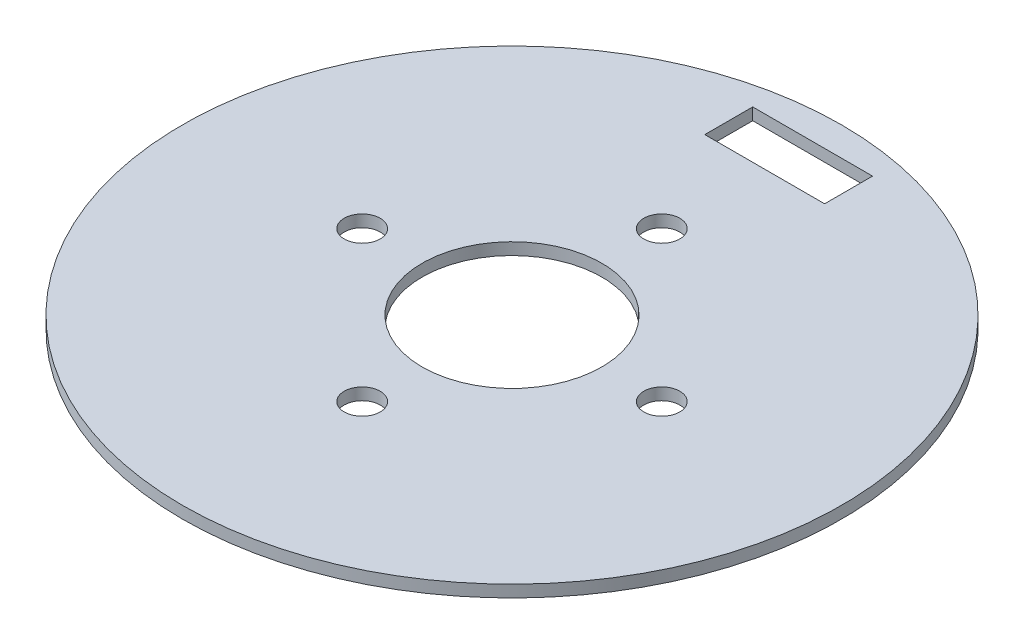
ISO-10303-21;
HEADER;
FILE_DESCRIPTION(('STEP AP214'),'2;1');
FILE_NAME('part.step','',(''),(''),'','','');
FILE_SCHEMA(('AUTOMOTIVE_DESIGN { 1 0 10303 214 1 1 1 1 }'));
ENDSEC;
DATA;
#1=APPLICATION_CONTEXT('core data for automotive mechanical design processes');
#2=APPLICATION_PROTOCOL_DEFINITION('international standard','automotive_design',2000,#1);
#3=PRODUCT_CONTEXT('',#1,'mechanical');
#4=PRODUCT('Part','Part','',(#3));
#5=PRODUCT_RELATED_PRODUCT_CATEGORY('part','',(#4));
#6=PRODUCT_DEFINITION_FORMATION('','',#4);
#7=PRODUCT_DEFINITION_CONTEXT('part definition',#1,'design');
#8=PRODUCT_DEFINITION('design','',#6,#7);
#9=PRODUCT_DEFINITION_SHAPE('','',#8);
#10=(LENGTH_UNIT() NAMED_UNIT(*) SI_UNIT(.MILLI.,.METRE.));
#11=(NAMED_UNIT(*) PLANE_ANGLE_UNIT() SI_UNIT($,.RADIAN.));
#12=(NAMED_UNIT(*) SI_UNIT($,.STERADIAN.) SOLID_ANGLE_UNIT());
#13=UNCERTAINTY_MEASURE_WITH_UNIT(LENGTH_MEASURE(1.E-05),#10,'distance_accuracy_value','');
#14=(GEOMETRIC_REPRESENTATION_CONTEXT(3) GLOBAL_UNCERTAINTY_ASSIGNED_CONTEXT((#13)) GLOBAL_UNIT_ASSIGNED_CONTEXT((#10,
#11,#12)) REPRESENTATION_CONTEXT('',''));
#15=CARTESIAN_POINT('',(0.,0.,0.));
#16=DIRECTION('',(0.,0.,1.));
#17=DIRECTION('',(1.,0.,0.));
#18=AXIS2_PLACEMENT_3D('',#15,#16,#17);
#19=CARTESIAN_POINT('',(0.,1.,0.));
#20=DIRECTION('',(0.,1.,0.));
#21=DIRECTION('',(0.,0.,1.));
#22=AXIS2_PLACEMENT_3D('',#19,#20,#21);
#23=PLANE('',#22);
#24=CARTESIAN_POINT('',(7.07481118762232E-13,1.,12.5));
#25=DIRECTION('',(0.,1.,0.));
#26=DIRECTION('',(0.,0.,1.));
#27=AXIS2_PLACEMENT_3D('',#24,#25,#26);
#28=CIRCLE('',#27,1.50000000000076);
#29=CARTESIAN_POINT('',(7.07481118762232E-13,1.,14.0000000000008));
#30=VERTEX_POINT('',#29);
#31=EDGE_CURVE('E115',#30,#30,#28,.T.);
#32=ORIENTED_EDGE('',*,*,#31,.F.);
#33=EDGE_LOOP('',(#32));
#34=FACE_BOUND('',#33,.T.);
#35=CARTESIAN_POINT('',(0.,1.,0.));
#36=DIRECTION('',(0.,1.,0.));
#37=DIRECTION('',(0.,0.,1.));
#38=AXIS2_PLACEMENT_3D('',#35,#36,#37);
#39=CIRCLE('',#38,7.5);
#40=CARTESIAN_POINT('',(0.,1.,7.5));
#41=VERTEX_POINT('',#40);
#42=EDGE_CURVE('E127',#41,#41,#39,.T.);
#43=ORIENTED_EDGE('',*,*,#42,.F.);
#44=EDGE_LOOP('',(#43));
#45=FACE_BOUND('',#44,.T.);
#46=CARTESIAN_POINT('',(0.,1.,0.));
#47=DIRECTION('',(0.,1.,0.));
#48=DIRECTION('',(0.,0.,1.));
#49=AXIS2_PLACEMENT_3D('',#46,#47,#48);
#50=CIRCLE('',#49,27.5);
#51=CARTESIAN_POINT('',(0.,1.,27.5));
#52=VERTEX_POINT('',#51);
#53=EDGE_CURVE('E11',#52,#52,#50,.T.);
#54=ORIENTED_EDGE('',*,*,#53,.T.);
#55=EDGE_LOOP('',(#54));
#56=FACE_BOUND('',#55,.T.);
#57=CARTESIAN_POINT('',(0.,1.,-12.5));
#58=DIRECTION('',(0.,1.,0.));
#59=DIRECTION('',(0.,0.,1.));
#60=AXIS2_PLACEMENT_3D('',#57,#58,#59);
#61=CIRCLE('',#60,1.5);
#62=CARTESIAN_POINT('',(0.,1.,-11.));
#63=VERTEX_POINT('',#62);
#64=EDGE_CURVE('E133',#63,#63,#61,.T.);
#65=ORIENTED_EDGE('',*,*,#64,.F.);
#66=EDGE_LOOP('',(#65));
#67=FACE_BOUND('',#66,.T.);
#68=CARTESIAN_POINT('',(12.5,1.,0.));
#69=DIRECTION('',(0.,1.,0.));
#70=DIRECTION('',(0.,0.,1.));
#71=AXIS2_PLACEMENT_3D('',#68,#69,#70);
#72=CIRCLE('',#71,1.5);
#73=CARTESIAN_POINT('',(12.5,1.,1.50000000000004));
#74=VERTEX_POINT('',#73);
#75=EDGE_CURVE('E121',#74,#74,#72,.T.);
#76=ORIENTED_EDGE('',*,*,#75,.F.);
#77=EDGE_LOOP('',(#76));
#78=FACE_BOUND('',#77,.T.);
#79=CARTESIAN_POINT('',(-12.5,1.,-1.30930550206618E-13));
#80=DIRECTION('',(0.,1.,0.));
#81=DIRECTION('',(0.,0.,1.));
#82=AXIS2_PLACEMENT_3D('',#79,#80,#81);
#83=CIRCLE('',#82,1.5);
#84=CARTESIAN_POINT('',(-12.5,1.,1.49999999999987));
#85=VERTEX_POINT('',#84);
#86=EDGE_CURVE('E109',#85,#85,#83,.T.);
#87=ORIENTED_EDGE('',*,*,#86,.F.);
#88=EDGE_LOOP('',(#87));
#89=FACE_BOUND('',#88,.T.);
#90=DIRECTION('',(-1.,0.,0.));
#91=VECTOR('',#90,1.);
#92=CARTESIAN_POINT('',(-5.,1.,-25.0863625228448));
#93=LINE('',#92,#91);
#94=CARTESIAN_POINT('',(5.,1.,-25.0863625228448));
#95=VERTEX_POINT('',#94);
#96=CARTESIAN_POINT('',(-5.,1.,-25.0863625228448));
#97=VERTEX_POINT('',#96);
#98=EDGE_CURVE('E81',#95,#97,#93,.T.);
#99=ORIENTED_EDGE('',*,*,#98,.F.);
#100=DIRECTION('',(0.,0.,-1.));
#101=VECTOR('',#100,1.);
#102=CARTESIAN_POINT('',(5.,1.,-25.0863625228448));
#103=LINE('',#102,#101);
#104=CARTESIAN_POINT('',(5.,1.,-21.0863625228448));
#105=VERTEX_POINT('',#104);
#106=EDGE_CURVE('E73',#105,#95,#103,.T.);
#107=ORIENTED_EDGE('',*,*,#106,.F.);
#108=DIRECTION('',(1.,0.,0.));
#109=VECTOR('',#108,1.);
#110=CARTESIAN_POINT('',(-5.,1.,-21.0863625228448));
#111=LINE('',#110,#109);
#112=CARTESIAN_POINT('',(-5.,1.,-21.0863625228448));
#113=VERTEX_POINT('',#112);
#114=EDGE_CURVE('E95',#113,#105,#111,.T.);
#115=ORIENTED_EDGE('',*,*,#114,.F.);
#116=DIRECTION('',(0.,0.,1.));
#117=VECTOR('',#116,1.);
#118=CARTESIAN_POINT('',(-5.,1.,-25.0863625228448));
#119=LINE('',#118,#117);
#120=EDGE_CURVE('E93',#97,#113,#119,.T.);
#121=ORIENTED_EDGE('',*,*,#120,.F.);
#122=EDGE_LOOP('',(#99,#107,#115,#121));
#123=FACE_BOUND('',#122,.T.);
#124=ADVANCED_FACE('F32',(#34,#45,#56,#67,#78,#89,#123),#23,.T.);
#125=CARTESIAN_POINT('',(0.,0.,0.));
#126=DIRECTION('',(0.,1.,0.));
#127=DIRECTION('',(0.,0.,1.));
#128=AXIS2_PLACEMENT_3D('',#125,#126,#127);
#129=PLANE('',#128);
#130=CARTESIAN_POINT('',(-12.5,0.,-1.30930550206618E-13));
#131=DIRECTION('',(0.,1.,0.));
#132=DIRECTION('',(0.,0.,1.));
#133=AXIS2_PLACEMENT_3D('',#130,#131,#132);
#134=CIRCLE('',#133,1.5);
#135=CARTESIAN_POINT('',(-12.5,0.,1.49999999999987));
#136=VERTEX_POINT('',#135);
#137=EDGE_CURVE('E89',#136,#136,#134,.T.);
#138=ORIENTED_EDGE('',*,*,#137,.T.);
#139=EDGE_LOOP('',(#138));
#140=FACE_BOUND('',#139,.T.);
#141=CARTESIAN_POINT('',(7.07481118762232E-13,0.,12.5));
#142=DIRECTION('',(0.,1.,0.));
#143=DIRECTION('',(0.,0.,1.));
#144=AXIS2_PLACEMENT_3D('',#141,#142,#143);
#145=CIRCLE('',#144,1.50000000000076);
#146=CARTESIAN_POINT('',(7.07481118762232E-13,0.,14.0000000000008));
#147=VERTEX_POINT('',#146);
#148=EDGE_CURVE('E112',#147,#147,#145,.T.);
#149=ORIENTED_EDGE('',*,*,#148,.T.);
#150=EDGE_LOOP('',(#149));
#151=FACE_BOUND('',#150,.T.);
#152=CARTESIAN_POINT('',(12.5,0.,0.));
#153=DIRECTION('',(0.,1.,0.));
#154=DIRECTION('',(0.,0.,1.));
#155=AXIS2_PLACEMENT_3D('',#152,#153,#154);
#156=CIRCLE('',#155,1.5);
#157=CARTESIAN_POINT('',(12.5,0.,1.50000000000004));
#158=VERTEX_POINT('',#157);
#159=EDGE_CURVE('E118',#158,#158,#156,.T.);
#160=ORIENTED_EDGE('',*,*,#159,.T.);
#161=EDGE_LOOP('',(#160));
#162=FACE_BOUND('',#161,.T.);
#163=CARTESIAN_POINT('',(0.,0.,0.));
#164=DIRECTION('',(0.,1.,0.));
#165=DIRECTION('',(0.,0.,1.));
#166=AXIS2_PLACEMENT_3D('',#163,#164,#165);
#167=CIRCLE('',#166,7.5);
#168=CARTESIAN_POINT('',(0.,0.,7.5));
#169=VERTEX_POINT('',#168);
#170=EDGE_CURVE('E124',#169,#169,#167,.T.);
#171=ORIENTED_EDGE('',*,*,#170,.T.);
#172=EDGE_LOOP('',(#171));
#173=FACE_BOUND('',#172,.T.);
#174=CARTESIAN_POINT('',(0.,0.,-12.5));
#175=DIRECTION('',(0.,1.,0.));
#176=DIRECTION('',(0.,0.,1.));
#177=AXIS2_PLACEMENT_3D('',#174,#175,#176);
#178=CIRCLE('',#177,1.5);
#179=CARTESIAN_POINT('',(0.,0.,-11.));
#180=VERTEX_POINT('',#179);
#181=EDGE_CURVE('E130',#180,#180,#178,.T.);
#182=ORIENTED_EDGE('',*,*,#181,.T.);
#183=EDGE_LOOP('',(#182));
#184=FACE_BOUND('',#183,.T.);
#185=CARTESIAN_POINT('',(0.,0.,0.));
#186=DIRECTION('',(0.,1.,0.));
#187=DIRECTION('',(0.,0.,1.));
#188=AXIS2_PLACEMENT_3D('',#185,#186,#187);
#189=CIRCLE('',#188,27.5);
#190=CARTESIAN_POINT('',(0.,0.,27.5));
#191=VERTEX_POINT('',#190);
#192=EDGE_CURVE('E36',#191,#191,#189,.T.);
#193=ORIENTED_EDGE('',*,*,#192,.F.);
#194=EDGE_LOOP('',(#193));
#195=FACE_BOUND('',#194,.T.);
#196=DIRECTION('',(0.,0.,-1.));
#197=VECTOR('',#196,1.);
#198=CARTESIAN_POINT('',(5.,0.,-25.0863625228448));
#199=LINE('',#198,#197);
#200=CARTESIAN_POINT('',(5.,0.,-21.0863625228448));
#201=VERTEX_POINT('',#200);
#202=CARTESIAN_POINT('',(5.,0.,-25.0863625228448));
#203=VERTEX_POINT('',#202);
#204=EDGE_CURVE('E55',#201,#203,#199,.T.);
#205=ORIENTED_EDGE('',*,*,#204,.T.);
#206=DIRECTION('',(-1.,0.,0.));
#207=VECTOR('',#206,1.);
#208=CARTESIAN_POINT('',(-5.,0.,-25.0863625228448));
#209=LINE('',#208,#207);
#210=CARTESIAN_POINT('',(-5.,0.,-25.0863625228448));
#211=VERTEX_POINT('',#210);
#212=EDGE_CURVE('E88',#203,#211,#209,.T.);
#213=ORIENTED_EDGE('',*,*,#212,.T.);
#214=DIRECTION('',(0.,0.,1.));
#215=VECTOR('',#214,1.);
#216=CARTESIAN_POINT('',(-5.,0.,-25.0863625228448));
#217=LINE('',#216,#215);
#218=CARTESIAN_POINT('',(-5.,0.,-21.0863625228448));
#219=VERTEX_POINT('',#218);
#220=EDGE_CURVE('E101',#211,#219,#217,.T.);
#221=ORIENTED_EDGE('',*,*,#220,.T.);
#222=DIRECTION('',(1.,0.,0.));
#223=VECTOR('',#222,1.);
#224=CARTESIAN_POINT('',(-5.,0.,-21.0863625228448));
#225=LINE('',#224,#223);
#226=EDGE_CURVE('E82',#219,#201,#225,.T.);
#227=ORIENTED_EDGE('',*,*,#226,.T.);
#228=EDGE_LOOP('',(#205,#213,#221,#227));
#229=FACE_BOUND('',#228,.T.);
#230=ADVANCED_FACE('F139',(#140,#151,#162,#173,#184,#195,#229),#129,.F.);
#231=CARTESIAN_POINT('',(0.,1.,0.));
#232=DIRECTION('',(0.,-1.,0.));
#233=DIRECTION('',(0.,0.,-1.));
#234=AXIS2_PLACEMENT_3D('',#231,#232,#233);
#235=CYLINDRICAL_SURFACE('',#234,27.5);
#236=ORIENTED_EDGE('',*,*,#53,.F.);
#237=EDGE_LOOP('',(#236));
#238=FACE_BOUND('',#237,.T.);
#239=ORIENTED_EDGE('',*,*,#192,.T.);
#240=EDGE_LOOP('',(#239));
#241=FACE_BOUND('',#240,.T.);
#242=ADVANCED_FACE('F34',(#238,#241),#235,.T.);
#243=CARTESIAN_POINT('',(0.,1.,-12.5));
#244=DIRECTION('',(0.,-1.,0.));
#245=DIRECTION('',(0.,0.,-1.));
#246=AXIS2_PLACEMENT_3D('',#243,#244,#245);
#247=CYLINDRICAL_SURFACE('',#246,1.5);
#248=ORIENTED_EDGE('',*,*,#64,.T.);
#249=EDGE_LOOP('',(#248));
#250=FACE_BOUND('',#249,.T.);
#251=ORIENTED_EDGE('',*,*,#181,.F.);
#252=EDGE_LOOP('',(#251));
#253=FACE_BOUND('',#252,.T.);
#254=ADVANCED_FACE('F142',(#250,#253),#247,.F.);
#255=CARTESIAN_POINT('',(0.,1.,0.));
#256=DIRECTION('',(0.,-1.,0.));
#257=DIRECTION('',(0.,0.,-1.));
#258=AXIS2_PLACEMENT_3D('',#255,#256,#257);
#259=CYLINDRICAL_SURFACE('',#258,7.5);
#260=ORIENTED_EDGE('',*,*,#42,.T.);
#261=EDGE_LOOP('',(#260));
#262=FACE_BOUND('',#261,.T.);
#263=ORIENTED_EDGE('',*,*,#170,.F.);
#264=EDGE_LOOP('',(#263));
#265=FACE_BOUND('',#264,.T.);
#266=ADVANCED_FACE('F144',(#262,#265),#259,.F.);
#267=CARTESIAN_POINT('',(12.5,1.,0.));
#268=DIRECTION('',(0.,-1.,0.));
#269=DIRECTION('',(0.,0.,-1.));
#270=AXIS2_PLACEMENT_3D('',#267,#268,#269);
#271=CYLINDRICAL_SURFACE('',#270,1.5);
#272=ORIENTED_EDGE('',*,*,#75,.T.);
#273=EDGE_LOOP('',(#272));
#274=FACE_BOUND('',#273,.T.);
#275=ORIENTED_EDGE('',*,*,#159,.F.);
#276=EDGE_LOOP('',(#275));
#277=FACE_BOUND('',#276,.T.);
#278=ADVANCED_FACE('F151',(#274,#277),#271,.F.);
#279=CARTESIAN_POINT('',(7.07481118762232E-13,1.,12.5));
#280=DIRECTION('',(0.,-1.,0.));
#281=DIRECTION('',(0.,0.,-1.));
#282=AXIS2_PLACEMENT_3D('',#279,#280,#281);
#283=CYLINDRICAL_SURFACE('',#282,1.50000000000076);
#284=ORIENTED_EDGE('',*,*,#31,.T.);
#285=EDGE_LOOP('',(#284));
#286=FACE_BOUND('',#285,.T.);
#287=ORIENTED_EDGE('',*,*,#148,.F.);
#288=EDGE_LOOP('',(#287));
#289=FACE_BOUND('',#288,.T.);
#290=ADVANCED_FACE('F177',(#286,#289),#283,.F.);
#291=CARTESIAN_POINT('',(-12.5,1.,-1.30930550206618E-13));
#292=DIRECTION('',(0.,-1.,0.));
#293=DIRECTION('',(0.,0.,-1.));
#294=AXIS2_PLACEMENT_3D('',#291,#292,#293);
#295=CYLINDRICAL_SURFACE('',#294,1.5);
#296=ORIENTED_EDGE('',*,*,#86,.T.);
#297=EDGE_LOOP('',(#296));
#298=FACE_BOUND('',#297,.T.);
#299=ORIENTED_EDGE('',*,*,#137,.F.);
#300=EDGE_LOOP('',(#299));
#301=FACE_BOUND('',#300,.T.);
#302=ADVANCED_FACE('F174',(#298,#301),#295,.F.);
#303=CARTESIAN_POINT('',(5.,1.,-25.0863625228448));
#304=DIRECTION('',(-1.,0.,0.));
#305=DIRECTION('',(0.,0.,1.));
#306=AXIS2_PLACEMENT_3D('',#303,#304,#305);
#307=PLANE('',#306);
#308=ORIENTED_EDGE('',*,*,#204,.F.);
#309=DIRECTION('',(0.,-1.,0.));
#310=VECTOR('',#309,1.);
#311=CARTESIAN_POINT('',(5.,1.,-21.0863625228448));
#312=LINE('',#311,#310);
#313=EDGE_CURVE('E77',#105,#201,#312,.T.);
#314=ORIENTED_EDGE('',*,*,#313,.F.);
#315=ORIENTED_EDGE('',*,*,#106,.T.);
#316=DIRECTION('',(0.,-1.,0.));
#317=VECTOR('',#316,1.);
#318=CARTESIAN_POINT('',(5.,1.,-25.0863625228448));
#319=LINE('',#318,#317);
#320=EDGE_CURVE('E76',#95,#203,#319,.T.);
#321=ORIENTED_EDGE('',*,*,#320,.T.);
#322=EDGE_LOOP('',(#308,#314,#315,#321));
#323=FACE_BOUND('',#322,.T.);
#324=ADVANCED_FACE('F75',(#323),#307,.T.);
#325=CARTESIAN_POINT('',(-5.,1.,-25.0863625228448));
#326=DIRECTION('',(0.,0.,1.));
#327=DIRECTION('',(1.,0.,0.));
#328=AXIS2_PLACEMENT_3D('',#325,#326,#327);
#329=PLANE('',#328);
#330=ORIENTED_EDGE('',*,*,#212,.F.);
#331=ORIENTED_EDGE('',*,*,#320,.F.);
#332=ORIENTED_EDGE('',*,*,#98,.T.);
#333=DIRECTION('',(0.,-1.,0.));
#334=VECTOR('',#333,1.);
#335=CARTESIAN_POINT('',(-5.,1.,-25.0863625228448));
#336=LINE('',#335,#334);
#337=EDGE_CURVE('E90',#97,#211,#336,.T.);
#338=ORIENTED_EDGE('',*,*,#337,.T.);
#339=EDGE_LOOP('',(#330,#331,#332,#338));
#340=FACE_BOUND('',#339,.T.);
#341=ADVANCED_FACE('F85',(#340),#329,.T.);
#342=CARTESIAN_POINT('',(-5.,1.,-25.0863625228448));
#343=DIRECTION('',(1.,0.,0.));
#344=DIRECTION('',(0.,0.,-1.));
#345=AXIS2_PLACEMENT_3D('',#342,#343,#344);
#346=PLANE('',#345);
#347=ORIENTED_EDGE('',*,*,#220,.F.);
#348=ORIENTED_EDGE('',*,*,#337,.F.);
#349=ORIENTED_EDGE('',*,*,#120,.T.);
#350=DIRECTION('',(0.,-1.,0.));
#351=VECTOR('',#350,1.);
#352=CARTESIAN_POINT('',(-5.,1.,-21.0863625228448));
#353=LINE('',#352,#351);
#354=EDGE_CURVE('E47',#113,#219,#353,.T.);
#355=ORIENTED_EDGE('',*,*,#354,.T.);
#356=EDGE_LOOP('',(#347,#348,#349,#355));
#357=FACE_BOUND('',#356,.T.);
#358=ADVANCED_FACE('F201',(#357),#346,.T.);
#359=CARTESIAN_POINT('',(-5.,1.,-21.0863625228448));
#360=DIRECTION('',(0.,0.,-1.));
#361=DIRECTION('',(-1.,0.,0.));
#362=AXIS2_PLACEMENT_3D('',#359,#360,#361);
#363=PLANE('',#362);
#364=ORIENTED_EDGE('',*,*,#226,.F.);
#365=ORIENTED_EDGE('',*,*,#354,.F.);
#366=ORIENTED_EDGE('',*,*,#114,.T.);
#367=ORIENTED_EDGE('',*,*,#313,.T.);
#368=EDGE_LOOP('',(#364,#365,#366,#367));
#369=FACE_BOUND('',#368,.T.);
#370=ADVANCED_FACE('F204',(#369),#363,.T.);
#371=CLOSED_SHELL('',(#124,#230,#242,#254,#266,#278,#290,#302,#324,#341,#358,#370));
#372=MANIFOLD_SOLID_BREP('B2',#371);
#373=ADVANCED_BREP_SHAPE_REPRESENTATION('',(#18,#372),#14);
#374=SHAPE_DEFINITION_REPRESENTATION(#9,#373);
ENDSEC;
END-ISO-10303-21;
